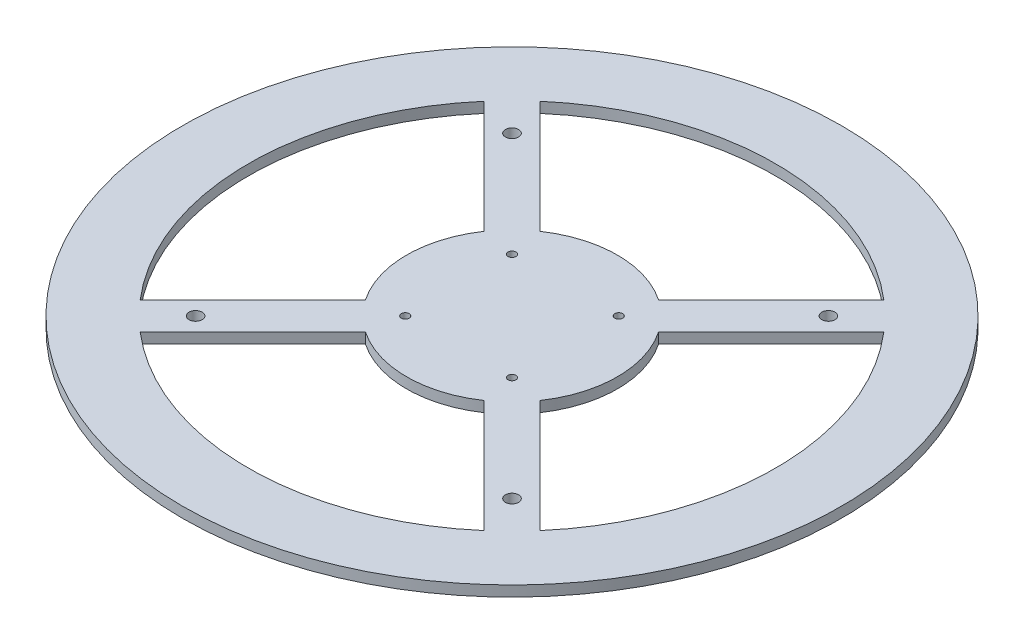
ISO-10303-21;
HEADER;
FILE_DESCRIPTION(('STEP AP214'),'2;1');
FILE_NAME('part.step','',(''),(''),'','','');
FILE_SCHEMA(('AUTOMOTIVE_DESIGN { 1 0 10303 214 1 1 1 1 }'));
ENDSEC;
DATA;
#1=APPLICATION_CONTEXT('core data for automotive mechanical design processes');
#2=APPLICATION_PROTOCOL_DEFINITION('international standard','automotive_design',2000,#1);
#3=PRODUCT_CONTEXT('',#1,'mechanical');
#4=PRODUCT('Part','Part','',(#3));
#5=PRODUCT_RELATED_PRODUCT_CATEGORY('part','',(#4));
#6=PRODUCT_DEFINITION_FORMATION('','',#4);
#7=PRODUCT_DEFINITION_CONTEXT('part definition',#1,'design');
#8=PRODUCT_DEFINITION('design','',#6,#7);
#9=PRODUCT_DEFINITION_SHAPE('','',#8);
#10=(LENGTH_UNIT() NAMED_UNIT(*) SI_UNIT(.MILLI.,.METRE.));
#11=(NAMED_UNIT(*) PLANE_ANGLE_UNIT() SI_UNIT($,.RADIAN.));
#12=(NAMED_UNIT(*) SI_UNIT($,.STERADIAN.) SOLID_ANGLE_UNIT());
#13=UNCERTAINTY_MEASURE_WITH_UNIT(LENGTH_MEASURE(1.E-05),#10,'distance_accuracy_value','');
#14=(GEOMETRIC_REPRESENTATION_CONTEXT(3) GLOBAL_UNCERTAINTY_ASSIGNED_CONTEXT((#13)) GLOBAL_UNIT_ASSIGNED_CONTEXT((#10,
#11,#12)) REPRESENTATION_CONTEXT('',''));
#15=CARTESIAN_POINT('',(0.,0.,0.));
#16=DIRECTION('',(0.,0.,1.));
#17=DIRECTION('',(1.,0.,0.));
#18=AXIS2_PLACEMENT_3D('',#15,#16,#17);
#19=CARTESIAN_POINT('',(0.,8.,0.));
#20=DIRECTION('',(0.,1.,0.));
#21=DIRECTION('',(0.,0.,1.));
#22=AXIS2_PLACEMENT_3D('',#19,#20,#21);
#23=PLANE('',#22);
#24=CARTESIAN_POINT('',(-40.499999999975,8.,40.5000000000209));
#25=DIRECTION('',(0.,1.,0.));
#26=DIRECTION('',(0.,0.,-1.));
#27=AXIS2_PLACEMENT_3D('',#24,#25,#26);
#28=CIRCLE('',#27,3.);
#29=CARTESIAN_POINT('',(-40.499999999975,8.,37.5000000000209));
#30=VERTEX_POINT('',#29);
#31=EDGE_CURVE('E469',#30,#30,#28,.T.);
#32=ORIENTED_EDGE('',*,*,#31,.F.);
#33=EDGE_LOOP('',(#32));
#34=FACE_BOUND('',#33,.T.);
#35=CARTESIAN_POINT('',(-40.5000000000205,8.,-40.4999999999755));
#36=DIRECTION('',(0.,1.,0.));
#37=DIRECTION('',(1.,0.,0.));
#38=AXIS2_PLACEMENT_3D('',#35,#36,#37);
#39=CIRCLE('',#38,3.);
#40=CARTESIAN_POINT('',(-37.5000000000205,8.,-40.4999999999754));
#41=VERTEX_POINT('',#40);
#42=EDGE_CURVE('E475',#41,#41,#39,.T.);
#43=ORIENTED_EDGE('',*,*,#42,.F.);
#44=EDGE_LOOP('',(#43));
#45=FACE_BOUND('',#44,.T.);
#46=CARTESIAN_POINT('',(40.5000000000208,8.,40.4999999999752));
#47=DIRECTION('',(0.,1.,0.));
#48=DIRECTION('',(-1.,0.,0.));
#49=AXIS2_PLACEMENT_3D('',#46,#47,#48);
#50=CIRCLE('',#49,3.);
#51=CARTESIAN_POINT('',(37.5000000000208,8.,40.4999999999752));
#52=VERTEX_POINT('',#51);
#53=EDGE_CURVE('E472',#52,#52,#50,.T.);
#54=ORIENTED_EDGE('',*,*,#53,.F.);
#55=EDGE_LOOP('',(#54));
#56=FACE_BOUND('',#55,.T.);
#57=CARTESIAN_POINT('',(40.499999999975,8.,-40.5000000000209));
#58=DIRECTION('',(0.,1.,0.));
#59=DIRECTION('',(0.,0.,1.));
#60=AXIS2_PLACEMENT_3D('',#57,#58,#59);
#61=CIRCLE('',#60,3.);
#62=CARTESIAN_POINT('',(40.499999999975,8.,-37.5000000000209));
#63=VERTEX_POINT('',#62);
#64=EDGE_CURVE('E483',#63,#63,#61,.T.);
#65=ORIENTED_EDGE('',*,*,#64,.F.);
#66=EDGE_LOOP('',(#65));
#67=FACE_BOUND('',#66,.T.);
#68=CARTESIAN_POINT('',(-120.000000000005,8.,-119.999999999997));
#69=DIRECTION('',(0.,1.,0.));
#70=DIRECTION('',(0.,0.,-1.));
#71=AXIS2_PLACEMENT_3D('',#68,#69,#70);
#72=CIRCLE('',#71,5.00000000001494);
#73=CARTESIAN_POINT('',(-120.000000000005,8.,-125.000000000012));
#74=VERTEX_POINT('',#73);
#75=EDGE_CURVE('E496',#74,#74,#72,.T.);
#76=ORIENTED_EDGE('',*,*,#75,.F.);
#77=EDGE_LOOP('',(#76));
#78=FACE_BOUND('',#77,.T.);
#79=CARTESIAN_POINT('',(119.999999999999,8.,-120.000000000004));
#80=DIRECTION('',(0.,1.,0.));
#81=DIRECTION('',(1.,0.,0.));
#82=AXIS2_PLACEMENT_3D('',#79,#80,#81);
#83=CIRCLE('',#82,5.00000000001494);
#84=CARTESIAN_POINT('',(125.000000000014,8.,-120.000000000004));
#85=VERTEX_POINT('',#84);
#86=EDGE_CURVE('E489',#85,#85,#83,.T.);
#87=ORIENTED_EDGE('',*,*,#86,.F.);
#88=EDGE_LOOP('',(#87));
#89=FACE_BOUND('',#88,.T.);
#90=CARTESIAN_POINT('',(-119.999999999998,8.,120.000000000005));
#91=DIRECTION('',(0.,1.,0.));
#92=DIRECTION('',(-1.,0.,0.));
#93=AXIS2_PLACEMENT_3D('',#90,#91,#92);
#94=CIRCLE('',#93,5.00000000001494);
#95=CARTESIAN_POINT('',(-125.000000000013,8.,120.000000000005));
#96=VERTEX_POINT('',#95);
#97=EDGE_CURVE('E495',#96,#96,#94,.T.);
#98=ORIENTED_EDGE('',*,*,#97,.F.);
#99=EDGE_LOOP('',(#98));
#100=FACE_BOUND('',#99,.T.);
#101=CARTESIAN_POINT('',(120.000000000005,8.,119.999999999997));
#102=DIRECTION('',(0.,1.,0.));
#103=DIRECTION('',(0.,0.,1.));
#104=AXIS2_PLACEMENT_3D('',#101,#102,#103);
#105=CIRCLE('',#104,5.00000000001494);
#106=CARTESIAN_POINT('',(120.000000000005,8.,125.000000000012));
#107=VERTEX_POINT('',#106);
#108=EDGE_CURVE('E507',#107,#107,#105,.T.);
#109=ORIENTED_EDGE('',*,*,#108,.F.);
#110=EDGE_LOOP('',(#109));
#111=FACE_BOUND('',#110,.T.);
#112=CARTESIAN_POINT('',(0.,8.,0.));
#113=DIRECTION('',(0.,1.,0.));
#114=DIRECTION('',(0.,0.,1.));
#115=AXIS2_PLACEMENT_3D('',#112,#113,#114);
#116=CIRCLE('',#115,250.);
#117=CARTESIAN_POINT('',(0.,8.,250.));
#118=VERTEX_POINT('',#117);
#119=EDGE_CURVE('E11',#118,#118,#116,.T.);
#120=ORIENTED_EDGE('',*,*,#119,.T.);
#121=EDGE_LOOP('',(#120));
#122=FACE_BOUND('',#121,.T.);
#123=DIRECTION('',(-0.707106781186551,0.,-0.707106781186544));
#124=VECTOR('',#123,1.);
#125=CARTESIAN_POINT('',(-66.1718786450306,8.,-44.9586752094336));
#126=LINE('',#125,#124);
#127=CARTESIAN_POINT('',(-66.1718786450306,8.,-44.9586752094336));
#128=VERTEX_POINT('',#127);
#129=CARTESIAN_POINT('',(-151.629649479503,8.,-130.416446043906));
#130=VERTEX_POINT('',#129);
#131=EDGE_CURVE('E250',#128,#130,#126,.T.);
#132=ORIENTED_EDGE('',*,*,#131,.F.);
#133=CARTESIAN_POINT('',(0.,8.,0.));
#134=DIRECTION('',(0.,-1.,0.));
#135=DIRECTION('',(0.,0.,1.));
#136=AXIS2_PLACEMENT_3D('',#133,#134,#135);
#137=CIRCLE('',#136,80.);
#138=CARTESIAN_POINT('',(-66.17187864503,8.,44.9586752094346));
#139=VERTEX_POINT('',#138);
#140=EDGE_CURVE('E248',#139,#128,#137,.T.);
#141=ORIENTED_EDGE('',*,*,#140,.F.);
#142=DIRECTION('',(0.707106781186541,0.,-0.707106781186554));
#143=VECTOR('',#142,1.);
#144=CARTESIAN_POINT('',(-66.17187864503,8.,44.9586752094346));
#145=LINE('',#144,#143);
#146=CARTESIAN_POINT('',(-151.629649479502,8.,130.416446043908));
#147=VERTEX_POINT('',#146);
#148=EDGE_CURVE('E256',#147,#139,#145,.T.);
#149=ORIENTED_EDGE('',*,*,#148,.F.);
#150=CARTESIAN_POINT('',(0.,8.,0.));
#151=DIRECTION('',(0.,1.,0.));
#152=DIRECTION('',(0.,0.,1.));
#153=AXIS2_PLACEMENT_3D('',#150,#151,#152);
#154=CIRCLE('',#153,200.);
#155=EDGE_CURVE('E253',#130,#147,#154,.T.);
#156=ORIENTED_EDGE('',*,*,#155,.F.);
#157=EDGE_LOOP('',(#132,#141,#149,#156));
#158=FACE_BOUND('',#157,.T.);
#159=DIRECTION('',(0.707106781186546,0.,-0.707106781186549));
#160=VECTOR('',#159,1.);
#161=CARTESIAN_POINT('',(44.9586752094338,8.,-66.1718786450305));
#162=LINE('',#161,#160);
#163=CARTESIAN_POINT('',(44.9586752094338,8.,-66.1718786450305));
#164=VERTEX_POINT('',#163);
#165=CARTESIAN_POINT('',(130.416446043906,8.,-151.629649479503));
#166=VERTEX_POINT('',#165);
#167=EDGE_CURVE('E219',#164,#166,#162,.T.);
#168=ORIENTED_EDGE('',*,*,#167,.F.);
#169=CARTESIAN_POINT('',(0.,8.,0.));
#170=DIRECTION('',(0.,-1.,0.));
#171=DIRECTION('',(0.,0.,1.));
#172=AXIS2_PLACEMENT_3D('',#169,#170,#171);
#173=CIRCLE('',#172,80.);
#174=CARTESIAN_POINT('',(-44.9586752094343,8.,-66.1718786450301));
#175=VERTEX_POINT('',#174);
#176=EDGE_CURVE('E217',#175,#164,#173,.T.);
#177=ORIENTED_EDGE('',*,*,#176,.F.);
#178=DIRECTION('',(0.707106781186551,0.,0.707106781186544));
#179=VECTOR('',#178,1.);
#180=CARTESIAN_POINT('',(-44.9586752094343,8.,-66.1718786450301));
#181=LINE('',#180,#179);
#182=CARTESIAN_POINT('',(-130.416446043907,8.,-151.629649479502));
#183=VERTEX_POINT('',#182);
#184=EDGE_CURVE('E225',#183,#175,#181,.T.);
#185=ORIENTED_EDGE('',*,*,#184,.F.);
#186=CARTESIAN_POINT('',(0.,8.,0.));
#187=DIRECTION('',(0.,1.,0.));
#188=DIRECTION('',(0.,0.,1.));
#189=AXIS2_PLACEMENT_3D('',#186,#187,#188);
#190=CIRCLE('',#189,200.);
#191=EDGE_CURVE('E222',#166,#183,#190,.T.);
#192=ORIENTED_EDGE('',*,*,#191,.F.);
#193=EDGE_LOOP('',(#168,#177,#185,#192));
#194=FACE_BOUND('',#193,.T.);
#195=DIRECTION('',(0.707106781186546,0.,0.707106781186549));
#196=VECTOR('',#195,1.);
#197=CARTESIAN_POINT('',(66.1718786450303,8.,44.958675209434));
#198=LINE('',#197,#196);
#199=CARTESIAN_POINT('',(66.1718786450303,8.,44.958675209434));
#200=VERTEX_POINT('',#199);
#201=CARTESIAN_POINT('',(151.629649479503,8.,130.416446043907));
#202=VERTEX_POINT('',#201);
#203=EDGE_CURVE('E188',#200,#202,#198,.T.);
#204=ORIENTED_EDGE('',*,*,#203,.F.);
#205=CARTESIAN_POINT('',(0.,8.,0.));
#206=DIRECTION('',(0.,-1.,0.));
#207=DIRECTION('',(0.,0.,1.));
#208=AXIS2_PLACEMENT_3D('',#205,#206,#207);
#209=CIRCLE('',#208,80.);
#210=CARTESIAN_POINT('',(66.1718786450303,8.,-44.9586752094341));
#211=VERTEX_POINT('',#210);
#212=EDGE_CURVE('E186',#211,#200,#209,.T.);
#213=ORIENTED_EDGE('',*,*,#212,.F.);
#214=DIRECTION('',(-0.707106781186546,0.,0.707106781186549));
#215=VECTOR('',#214,1.);
#216=CARTESIAN_POINT('',(66.1718786450303,8.,-44.9586752094341));
#217=LINE('',#216,#215);
#218=CARTESIAN_POINT('',(151.629649479503,8.,-130.416446043907));
#219=VERTEX_POINT('',#218);
#220=EDGE_CURVE('E194',#219,#211,#217,.T.);
#221=ORIENTED_EDGE('',*,*,#220,.F.);
#222=CARTESIAN_POINT('',(0.,8.,0.));
#223=DIRECTION('',(0.,1.,0.));
#224=DIRECTION('',(0.,0.,1.));
#225=AXIS2_PLACEMENT_3D('',#222,#223,#224);
#226=CIRCLE('',#225,200.);
#227=EDGE_CURVE('E191',#202,#219,#226,.T.);
#228=ORIENTED_EDGE('',*,*,#227,.F.);
#229=EDGE_LOOP('',(#204,#213,#221,#228));
#230=FACE_BOUND('',#229,.T.);
#231=DIRECTION('',(-0.707106781186551,0.,0.707106781186544));
#232=VECTOR('',#231,1.);
#233=CARTESIAN_POINT('',(-44.9586752094343,8.,66.1718786450302));
#234=LINE('',#233,#232);
#235=CARTESIAN_POINT('',(-44.9586752094343,8.,66.1718786450302));
#236=VERTEX_POINT('',#235);
#237=CARTESIAN_POINT('',(-130.416446043907,8.,151.629649479502));
#238=VERTEX_POINT('',#237);
#239=EDGE_CURVE('E156',#236,#238,#234,.T.);
#240=ORIENTED_EDGE('',*,*,#239,.F.);
#241=CARTESIAN_POINT('',(0.,8.,0.));
#242=DIRECTION('',(0.,-1.,0.));
#243=DIRECTION('',(0.,0.,1.));
#244=AXIS2_PLACEMENT_3D('',#241,#242,#243);
#245=CIRCLE('',#244,80.);
#246=CARTESIAN_POINT('',(44.9586752094339,8.,66.1718786450304));
#247=VERTEX_POINT('',#246);
#248=EDGE_CURVE('E148',#247,#236,#245,.T.);
#249=ORIENTED_EDGE('',*,*,#248,.F.);
#250=DIRECTION('',(-0.707106781186546,0.,-0.707106781186549));
#251=VECTOR('',#250,1.);
#252=CARTESIAN_POINT('',(44.9586752094339,8.,66.1718786450304));
#253=LINE('',#252,#251);
#254=CARTESIAN_POINT('',(130.416446043906,8.,151.629649479503));
#255=VERTEX_POINT('',#254);
#256=EDGE_CURVE('E170',#255,#247,#253,.T.);
#257=ORIENTED_EDGE('',*,*,#256,.F.);
#258=CARTESIAN_POINT('',(0.,8.,0.));
#259=DIRECTION('',(0.,1.,0.));
#260=DIRECTION('',(0.,0.,1.));
#261=AXIS2_PLACEMENT_3D('',#258,#259,#260);
#262=CIRCLE('',#261,200.);
#263=EDGE_CURVE('E168',#238,#255,#262,.T.);
#264=ORIENTED_EDGE('',*,*,#263,.F.);
#265=EDGE_LOOP('',(#240,#249,#257,#264));
#266=FACE_BOUND('',#265,.T.);
#267=ADVANCED_FACE('F35',(#34,#45,#56,#67,#78,#89,#100,#111,#122,#158,#194,#230,#266),#23,.T.);
#268=CARTESIAN_POINT('',(0.,0.,0.));
#269=DIRECTION('',(0.,1.,0.));
#270=DIRECTION('',(0.,0.,1.));
#271=AXIS2_PLACEMENT_3D('',#268,#269,#270);
#272=PLANE('',#271);
#273=CARTESIAN_POINT('',(-40.499999999975,0.,40.5000000000209));
#274=DIRECTION('',(0.,1.,0.));
#275=DIRECTION('',(0.,0.,-1.));
#276=AXIS2_PLACEMENT_3D('',#273,#274,#275);
#277=CIRCLE('',#276,3.);
#278=CARTESIAN_POINT('',(-40.499999999975,0.,37.5000000000209));
#279=VERTEX_POINT('',#278);
#280=EDGE_CURVE('E467',#279,#279,#277,.T.);
#281=ORIENTED_EDGE('',*,*,#280,.T.);
#282=EDGE_LOOP('',(#281));
#283=FACE_BOUND('',#282,.T.);
#284=CARTESIAN_POINT('',(-40.5000000000205,0.,-40.4999999999755));
#285=DIRECTION('',(0.,1.,0.));
#286=DIRECTION('',(1.,0.,0.));
#287=AXIS2_PLACEMENT_3D('',#284,#285,#286);
#288=CIRCLE('',#287,3.);
#289=CARTESIAN_POINT('',(-37.5000000000205,0.,-40.4999999999754));
#290=VERTEX_POINT('',#289);
#291=EDGE_CURVE('E470',#290,#290,#288,.T.);
#292=ORIENTED_EDGE('',*,*,#291,.T.);
#293=EDGE_LOOP('',(#292));
#294=FACE_BOUND('',#293,.T.);
#295=CARTESIAN_POINT('',(40.5000000000208,0.,40.4999999999752));
#296=DIRECTION('',(0.,1.,0.));
#297=DIRECTION('',(-1.,0.,0.));
#298=AXIS2_PLACEMENT_3D('',#295,#296,#297);
#299=CIRCLE('',#298,3.);
#300=CARTESIAN_POINT('',(37.5000000000208,0.,40.4999999999752));
#301=VERTEX_POINT('',#300);
#302=EDGE_CURVE('E480',#301,#301,#299,.T.);
#303=ORIENTED_EDGE('',*,*,#302,.T.);
#304=EDGE_LOOP('',(#303));
#305=FACE_BOUND('',#304,.T.);
#306=CARTESIAN_POINT('',(40.499999999975,0.,-40.5000000000209));
#307=DIRECTION('',(0.,1.,0.));
#308=DIRECTION('',(0.,0.,1.));
#309=AXIS2_PLACEMENT_3D('',#306,#307,#308);
#310=CIRCLE('',#309,3.);
#311=CARTESIAN_POINT('',(40.499999999975,0.,-37.5000000000209));
#312=VERTEX_POINT('',#311);
#313=EDGE_CURVE('E486',#312,#312,#310,.T.);
#314=ORIENTED_EDGE('',*,*,#313,.T.);
#315=EDGE_LOOP('',(#314));
#316=FACE_BOUND('',#315,.T.);
#317=CARTESIAN_POINT('',(-120.000000000005,0.,-119.999999999997));
#318=DIRECTION('',(0.,1.,0.));
#319=DIRECTION('',(0.,0.,-1.));
#320=AXIS2_PLACEMENT_3D('',#317,#318,#319);
#321=CIRCLE('',#320,5.00000000001494);
#322=CARTESIAN_POINT('',(-120.000000000005,0.,-125.000000000012));
#323=VERTEX_POINT('',#322);
#324=EDGE_CURVE('E492',#323,#323,#321,.T.);
#325=ORIENTED_EDGE('',*,*,#324,.T.);
#326=EDGE_LOOP('',(#325));
#327=FACE_BOUND('',#326,.T.);
#328=CARTESIAN_POINT('',(119.999999999999,0.,-120.000000000004));
#329=DIRECTION('',(0.,1.,0.));
#330=DIRECTION('',(1.,0.,0.));
#331=AXIS2_PLACEMENT_3D('',#328,#329,#330);
#332=CIRCLE('',#331,5.00000000001494);
#333=CARTESIAN_POINT('',(125.000000000014,0.,-120.000000000004));
#334=VERTEX_POINT('',#333);
#335=EDGE_CURVE('E499',#334,#334,#332,.T.);
#336=ORIENTED_EDGE('',*,*,#335,.T.);
#337=EDGE_LOOP('',(#336));
#338=FACE_BOUND('',#337,.T.);
#339=CARTESIAN_POINT('',(-119.999999999998,0.,120.000000000005));
#340=DIRECTION('',(0.,1.,0.));
#341=DIRECTION('',(-1.,0.,0.));
#342=AXIS2_PLACEMENT_3D('',#339,#340,#341);
#343=CIRCLE('',#342,5.00000000001494);
#344=CARTESIAN_POINT('',(-125.000000000013,0.,120.000000000005));
#345=VERTEX_POINT('',#344);
#346=EDGE_CURVE('E504',#345,#345,#343,.T.);
#347=ORIENTED_EDGE('',*,*,#346,.T.);
#348=EDGE_LOOP('',(#347));
#349=FACE_BOUND('',#348,.T.);
#350=CARTESIAN_POINT('',(120.000000000005,0.,119.999999999997));
#351=DIRECTION('',(0.,1.,0.));
#352=DIRECTION('',(0.,0.,1.));
#353=AXIS2_PLACEMENT_3D('',#350,#351,#352);
#354=CIRCLE('',#353,5.00000000001494);
#355=CARTESIAN_POINT('',(120.000000000005,0.,125.000000000012));
#356=VERTEX_POINT('',#355);
#357=EDGE_CURVE('E176',#356,#356,#354,.T.);
#358=ORIENTED_EDGE('',*,*,#357,.T.);
#359=EDGE_LOOP('',(#358));
#360=FACE_BOUND('',#359,.T.);
#361=CARTESIAN_POINT('',(0.,0.,0.));
#362=DIRECTION('',(0.,-1.,0.));
#363=DIRECTION('',(0.,0.,1.));
#364=AXIS2_PLACEMENT_3D('',#361,#362,#363);
#365=CIRCLE('',#364,80.);
#366=CARTESIAN_POINT('',(66.1718786450303,0.,-44.9586752094341));
#367=VERTEX_POINT('',#366);
#368=CARTESIAN_POINT('',(66.1718786450303,0.,44.958675209434));
#369=VERTEX_POINT('',#368);
#370=EDGE_CURVE('E164',#367,#369,#365,.T.);
#371=ORIENTED_EDGE('',*,*,#370,.T.);
#372=DIRECTION('',(0.707106781186546,0.,0.707106781186549));
#373=VECTOR('',#372,1.);
#374=CARTESIAN_POINT('',(66.1718786450303,0.,44.958675209434));
#375=LINE('',#374,#373);
#376=CARTESIAN_POINT('',(151.629649479503,0.,130.416446043907));
#377=VERTEX_POINT('',#376);
#378=EDGE_CURVE('E199',#369,#377,#375,.T.);
#379=ORIENTED_EDGE('',*,*,#378,.T.);
#380=CARTESIAN_POINT('',(0.,0.,0.));
#381=DIRECTION('',(0.,1.,0.));
#382=DIRECTION('',(0.,0.,1.));
#383=AXIS2_PLACEMENT_3D('',#380,#381,#382);
#384=CIRCLE('',#383,200.);
#385=CARTESIAN_POINT('',(151.629649479503,0.,-130.416446043907));
#386=VERTEX_POINT('',#385);
#387=EDGE_CURVE('E202',#377,#386,#384,.T.);
#388=ORIENTED_EDGE('',*,*,#387,.T.);
#389=DIRECTION('',(-0.707106781186546,0.,0.707106781186549));
#390=VECTOR('',#389,1.);
#391=CARTESIAN_POINT('',(66.1718786450303,0.,-44.9586752094341));
#392=LINE('',#391,#390);
#393=EDGE_CURVE('E189',#386,#367,#392,.T.);
#394=ORIENTED_EDGE('',*,*,#393,.T.);
#395=EDGE_LOOP('',(#371,#379,#388,#394));
#396=FACE_BOUND('',#395,.T.);
#397=CARTESIAN_POINT('',(0.,0.,0.));
#398=DIRECTION('',(0.,-1.,0.));
#399=DIRECTION('',(0.,0.,1.));
#400=AXIS2_PLACEMENT_3D('',#397,#398,#399);
#401=CIRCLE('',#400,80.);
#402=CARTESIAN_POINT('',(-66.17187864503,0.,44.9586752094346));
#403=VERTEX_POINT('',#402);
#404=CARTESIAN_POINT('',(-66.1718786450306,0.,-44.9586752094336));
#405=VERTEX_POINT('',#404);
#406=EDGE_CURVE('E247',#403,#405,#401,.T.);
#407=ORIENTED_EDGE('',*,*,#406,.T.);
#408=DIRECTION('',(-0.707106781186551,0.,-0.707106781186544));
#409=VECTOR('',#408,1.);
#410=CARTESIAN_POINT('',(-66.1718786450306,0.,-44.9586752094336));
#411=LINE('',#410,#409);
#412=CARTESIAN_POINT('',(-151.629649479503,0.,-130.416446043906));
#413=VERTEX_POINT('',#412);
#414=EDGE_CURVE('E261',#405,#413,#411,.T.);
#415=ORIENTED_EDGE('',*,*,#414,.T.);
#416=CARTESIAN_POINT('',(0.,0.,0.));
#417=DIRECTION('',(0.,1.,0.));
#418=DIRECTION('',(0.,0.,1.));
#419=AXIS2_PLACEMENT_3D('',#416,#417,#418);
#420=CIRCLE('',#419,200.);
#421=CARTESIAN_POINT('',(-151.629649479502,0.,130.416446043908));
#422=VERTEX_POINT('',#421);
#423=EDGE_CURVE('E264',#413,#422,#420,.T.);
#424=ORIENTED_EDGE('',*,*,#423,.T.);
#425=DIRECTION('',(0.707106781186541,0.,-0.707106781186554));
#426=VECTOR('',#425,1.);
#427=CARTESIAN_POINT('',(-66.17187864503,0.,44.9586752094346));
#428=LINE('',#427,#426);
#429=EDGE_CURVE('E251',#422,#403,#428,.T.);
#430=ORIENTED_EDGE('',*,*,#429,.T.);
#431=EDGE_LOOP('',(#407,#415,#424,#430));
#432=FACE_BOUND('',#431,.T.);
#433=CARTESIAN_POINT('',(0.,0.,0.));
#434=DIRECTION('',(0.,1.,0.));
#435=DIRECTION('',(0.,0.,1.));
#436=AXIS2_PLACEMENT_3D('',#433,#434,#435);
#437=CIRCLE('',#436,250.);
#438=CARTESIAN_POINT('',(0.,0.,250.));
#439=VERTEX_POINT('',#438);
#440=EDGE_CURVE('E39',#439,#439,#437,.T.);
#441=ORIENTED_EDGE('',*,*,#440,.F.);
#442=EDGE_LOOP('',(#441));
#443=FACE_BOUND('',#442,.T.);
#444=CARTESIAN_POINT('',(0.,0.,0.));
#445=DIRECTION('',(0.,-1.,0.));
#446=DIRECTION('',(0.,0.,1.));
#447=AXIS2_PLACEMENT_3D('',#444,#445,#446);
#448=CIRCLE('',#447,80.);
#449=CARTESIAN_POINT('',(-44.9586752094343,0.,-66.1718786450301));
#450=VERTEX_POINT('',#449);
#451=CARTESIAN_POINT('',(44.9586752094338,0.,-66.1718786450305));
#452=VERTEX_POINT('',#451);
#453=EDGE_CURVE('E216',#450,#452,#448,.T.);
#454=ORIENTED_EDGE('',*,*,#453,.T.);
#455=DIRECTION('',(0.707106781186546,0.,-0.707106781186549));
#456=VECTOR('',#455,1.);
#457=CARTESIAN_POINT('',(44.9586752094338,0.,-66.1718786450305));
#458=LINE('',#457,#456);
#459=CARTESIAN_POINT('',(130.416446043906,0.,-151.629649479503));
#460=VERTEX_POINT('',#459);
#461=EDGE_CURVE('E230',#452,#460,#458,.T.);
#462=ORIENTED_EDGE('',*,*,#461,.T.);
#463=CARTESIAN_POINT('',(0.,0.,0.));
#464=DIRECTION('',(0.,1.,0.));
#465=DIRECTION('',(0.,0.,1.));
#466=AXIS2_PLACEMENT_3D('',#463,#464,#465);
#467=CIRCLE('',#466,200.);
#468=CARTESIAN_POINT('',(-130.416446043907,0.,-151.629649479502));
#469=VERTEX_POINT('',#468);
#470=EDGE_CURVE('E233',#460,#469,#467,.T.);
#471=ORIENTED_EDGE('',*,*,#470,.T.);
#472=DIRECTION('',(0.707106781186551,0.,0.707106781186544));
#473=VECTOR('',#472,1.);
#474=CARTESIAN_POINT('',(-44.9586752094343,0.,-66.1718786450301));
#475=LINE('',#474,#473);
#476=EDGE_CURVE('E220',#469,#450,#475,.T.);
#477=ORIENTED_EDGE('',*,*,#476,.T.);
#478=EDGE_LOOP('',(#454,#462,#471,#477));
#479=FACE_BOUND('',#478,.T.);
#480=CARTESIAN_POINT('',(0.,0.,0.));
#481=DIRECTION('',(0.,-1.,0.));
#482=DIRECTION('',(0.,0.,1.));
#483=AXIS2_PLACEMENT_3D('',#480,#481,#482);
#484=CIRCLE('',#483,80.);
#485=CARTESIAN_POINT('',(44.9586752094339,0.,66.1718786450304));
#486=VERTEX_POINT('',#485);
#487=CARTESIAN_POINT('',(-44.9586752094343,0.,66.1718786450302));
#488=VERTEX_POINT('',#487);
#489=EDGE_CURVE('E58',#486,#488,#484,.T.);
#490=ORIENTED_EDGE('',*,*,#489,.T.);
#491=DIRECTION('',(-0.707106781186551,0.,0.707106781186544));
#492=VECTOR('',#491,1.);
#493=CARTESIAN_POINT('',(-44.9586752094343,0.,66.1718786450302));
#494=LINE('',#493,#492);
#495=CARTESIAN_POINT('',(-130.416446043907,0.,151.629649479502));
#496=VERTEX_POINT('',#495);
#497=EDGE_CURVE('E163',#488,#496,#494,.T.);
#498=ORIENTED_EDGE('',*,*,#497,.T.);
#499=CARTESIAN_POINT('',(0.,0.,0.));
#500=DIRECTION('',(0.,1.,0.));
#501=DIRECTION('',(0.,0.,1.));
#502=AXIS2_PLACEMENT_3D('',#499,#500,#501);
#503=CIRCLE('',#502,200.);
#504=CARTESIAN_POINT('',(130.416446043906,0.,151.629649479503));
#505=VERTEX_POINT('',#504);
#506=EDGE_CURVE('E178',#496,#505,#503,.T.);
#507=ORIENTED_EDGE('',*,*,#506,.T.);
#508=DIRECTION('',(-0.707106781186546,0.,-0.707106781186549));
#509=VECTOR('',#508,1.);
#510=CARTESIAN_POINT('',(44.9586752094339,0.,66.1718786450304));
#511=LINE('',#510,#509);
#512=EDGE_CURVE('E157',#505,#486,#511,.T.);
#513=ORIENTED_EDGE('',*,*,#512,.T.);
#514=EDGE_LOOP('',(#490,#498,#507,#513));
#515=FACE_BOUND('',#514,.T.);
#516=ADVANCED_FACE('F283',(#283,#294,#305,#316,#327,#338,#349,#360,#396,#432,#443,#479,#515),
#272,.F.);
#517=CARTESIAN_POINT('',(0.,8.,0.));
#518=DIRECTION('',(0.,-1.,0.));
#519=DIRECTION('',(0.,0.,-1.));
#520=AXIS2_PLACEMENT_3D('',#517,#518,#519);
#521=CYLINDRICAL_SURFACE('',#520,250.);
#522=ORIENTED_EDGE('',*,*,#119,.F.);
#523=EDGE_LOOP('',(#522));
#524=FACE_BOUND('',#523,.T.);
#525=ORIENTED_EDGE('',*,*,#440,.T.);
#526=EDGE_LOOP('',(#525));
#527=FACE_BOUND('',#526,.T.);
#528=ADVANCED_FACE('F37',(#524,#527),#521,.T.);
#529=CARTESIAN_POINT('',(0.,8.,0.));
#530=DIRECTION('',(0.,-1.,0.));
#531=DIRECTION('',(0.,0.,-1.));
#532=AXIS2_PLACEMENT_3D('',#529,#530,#531);
#533=CYLINDRICAL_SURFACE('',#532,80.);
#534=ORIENTED_EDGE('',*,*,#406,.F.);
#535=DIRECTION('',(0.,-1.,0.));
#536=VECTOR('',#535,1.);
#537=CARTESIAN_POINT('',(-66.17187864503,8.,44.9586752094346));
#538=LINE('',#537,#536);
#539=EDGE_CURVE('E258',#139,#403,#538,.T.);
#540=ORIENTED_EDGE('',*,*,#539,.F.);
#541=ORIENTED_EDGE('',*,*,#140,.T.);
#542=DIRECTION('',(0.,-1.,0.));
#543=VECTOR('',#542,1.);
#544=CARTESIAN_POINT('',(-66.1718786450306,8.,-44.9586752094336));
#545=LINE('',#544,#543);
#546=EDGE_CURVE('E275',#128,#405,#545,.T.);
#547=ORIENTED_EDGE('',*,*,#546,.T.);
#548=EDGE_LOOP('',(#534,#540,#541,#547));
#549=FACE_BOUND('',#548,.T.);
#550=ADVANCED_FACE('F311',(#549),#533,.T.);
#551=CARTESIAN_POINT('',(-66.1718786450306,8.,-44.9586752094336));
#552=DIRECTION('',(-0.707106781186544,0.,0.707106781186551));
#553=DIRECTION('',(0.707106781186551,0.,0.707106781186544));
#554=AXIS2_PLACEMENT_3D('',#551,#552,#553);
#555=PLANE('',#554);
#556=ORIENTED_EDGE('',*,*,#414,.F.);
#557=ORIENTED_EDGE('',*,*,#546,.F.);
#558=ORIENTED_EDGE('',*,*,#131,.T.);
#559=DIRECTION('',(0.,-1.,0.));
#560=VECTOR('',#559,1.);
#561=CARTESIAN_POINT('',(-151.629649479503,8.,-130.416446043906));
#562=LINE('',#561,#560);
#563=EDGE_CURVE('E273',#130,#413,#562,.T.);
#564=ORIENTED_EDGE('',*,*,#563,.T.);
#565=EDGE_LOOP('',(#556,#557,#558,#564));
#566=FACE_BOUND('',#565,.T.);
#567=ADVANCED_FACE('F314',(#566),#555,.T.);
#568=CARTESIAN_POINT('',(0.,8.,0.));
#569=DIRECTION('',(0.,-1.,0.));
#570=DIRECTION('',(0.,0.,-1.));
#571=AXIS2_PLACEMENT_3D('',#568,#569,#570);
#572=CYLINDRICAL_SURFACE('',#571,200.);
#573=ORIENTED_EDGE('',*,*,#423,.F.);
#574=ORIENTED_EDGE('',*,*,#563,.F.);
#575=ORIENTED_EDGE('',*,*,#155,.T.);
#576=DIRECTION('',(0.,-1.,0.));
#577=VECTOR('',#576,1.);
#578=CARTESIAN_POINT('',(-151.629649479502,8.,130.416446043908));
#579=LINE('',#578,#577);
#580=EDGE_CURVE('E271',#147,#422,#579,.T.);
#581=ORIENTED_EDGE('',*,*,#580,.T.);
#582=EDGE_LOOP('',(#573,#574,#575,#581));
#583=FACE_BOUND('',#582,.T.);
#584=ADVANCED_FACE('F317',(#583),#572,.F.);
#585=CARTESIAN_POINT('',(-66.17187864503,8.,44.9586752094346));
#586=DIRECTION('',(-0.707106781186554,0.,-0.707106781186541));
#587=DIRECTION('',(-0.707106781186541,0.,0.707106781186554));
#588=AXIS2_PLACEMENT_3D('',#585,#586,#587);
#589=PLANE('',#588);
#590=ORIENTED_EDGE('',*,*,#429,.F.);
#591=ORIENTED_EDGE('',*,*,#580,.F.);
#592=ORIENTED_EDGE('',*,*,#148,.T.);
#593=ORIENTED_EDGE('',*,*,#539,.T.);
#594=EDGE_LOOP('',(#590,#591,#592,#593));
#595=FACE_BOUND('',#594,.T.);
#596=ADVANCED_FACE('F321',(#595),#589,.T.);
#597=CARTESIAN_POINT('',(0.,8.,0.));
#598=DIRECTION('',(0.,-1.,0.));
#599=DIRECTION('',(0.,0.,-1.));
#600=AXIS2_PLACEMENT_3D('',#597,#598,#599);
#601=CYLINDRICAL_SURFACE('',#600,80.);
#602=ORIENTED_EDGE('',*,*,#453,.F.);
#603=DIRECTION('',(0.,-1.,0.));
#604=VECTOR('',#603,1.);
#605=CARTESIAN_POINT('',(-44.9586752094343,8.,-66.1718786450301));
#606=LINE('',#605,#604);
#607=EDGE_CURVE('E227',#175,#450,#606,.T.);
#608=ORIENTED_EDGE('',*,*,#607,.F.);
#609=ORIENTED_EDGE('',*,*,#176,.T.);
#610=DIRECTION('',(0.,-1.,0.));
#611=VECTOR('',#610,1.);
#612=CARTESIAN_POINT('',(44.9586752094338,8.,-66.1718786450305));
#613=LINE('',#612,#611);
#614=EDGE_CURVE('E244',#164,#452,#613,.T.);
#615=ORIENTED_EDGE('',*,*,#614,.T.);
#616=EDGE_LOOP('',(#602,#608,#609,#615));
#617=FACE_BOUND('',#616,.T.);
#618=ADVANCED_FACE('F325',(#617),#601,.T.);
#619=CARTESIAN_POINT('',(44.9586752094338,8.,-66.1718786450305));
#620=DIRECTION('',(-0.707106781186549,0.,-0.707106781186546));
#621=DIRECTION('',(-0.707106781186546,0.,0.707106781186549));
#622=AXIS2_PLACEMENT_3D('',#619,#620,#621);
#623=PLANE('',#622);
#624=ORIENTED_EDGE('',*,*,#461,.F.);
#625=ORIENTED_EDGE('',*,*,#614,.F.);
#626=ORIENTED_EDGE('',*,*,#167,.T.);
#627=DIRECTION('',(0.,-1.,0.));
#628=VECTOR('',#627,1.);
#629=CARTESIAN_POINT('',(130.416446043906,8.,-151.629649479503));
#630=LINE('',#629,#628);
#631=EDGE_CURVE('E242',#166,#460,#630,.T.);
#632=ORIENTED_EDGE('',*,*,#631,.T.);
#633=EDGE_LOOP('',(#624,#625,#626,#632));
#634=FACE_BOUND('',#633,.T.);
#635=ADVANCED_FACE('F329',(#634),#623,.T.);
#636=CARTESIAN_POINT('',(0.,8.,0.));
#637=DIRECTION('',(0.,-1.,0.));
#638=DIRECTION('',(0.,0.,-1.));
#639=AXIS2_PLACEMENT_3D('',#636,#637,#638);
#640=CYLINDRICAL_SURFACE('',#639,200.);
#641=ORIENTED_EDGE('',*,*,#470,.F.);
#642=ORIENTED_EDGE('',*,*,#631,.F.);
#643=ORIENTED_EDGE('',*,*,#191,.T.);
#644=DIRECTION('',(0.,-1.,0.));
#645=VECTOR('',#644,1.);
#646=CARTESIAN_POINT('',(-130.416446043907,8.,-151.629649479502));
#647=LINE('',#646,#645);
#648=EDGE_CURVE('E240',#183,#469,#647,.T.);
#649=ORIENTED_EDGE('',*,*,#648,.T.);
#650=EDGE_LOOP('',(#641,#642,#643,#649));
#651=FACE_BOUND('',#650,.T.);
#652=ADVANCED_FACE('F333',(#651),#640,.F.);
#653=CARTESIAN_POINT('',(-44.9586752094343,8.,-66.1718786450301));
#654=DIRECTION('',(0.707106781186544,0.,-0.707106781186551));
#655=DIRECTION('',(-0.707106781186551,0.,-0.707106781186544));
#656=AXIS2_PLACEMENT_3D('',#653,#654,#655);
#657=PLANE('',#656);
#658=ORIENTED_EDGE('',*,*,#476,.F.);
#659=ORIENTED_EDGE('',*,*,#648,.F.);
#660=ORIENTED_EDGE('',*,*,#184,.T.);
#661=ORIENTED_EDGE('',*,*,#607,.T.);
#662=EDGE_LOOP('',(#658,#659,#660,#661));
#663=FACE_BOUND('',#662,.T.);
#664=ADVANCED_FACE('F337',(#663),#657,.T.);
#665=CARTESIAN_POINT('',(0.,8.,0.));
#666=DIRECTION('',(0.,-1.,0.));
#667=DIRECTION('',(0.,0.,-1.));
#668=AXIS2_PLACEMENT_3D('',#665,#666,#667);
#669=CYLINDRICAL_SURFACE('',#668,80.);
#670=ORIENTED_EDGE('',*,*,#370,.F.);
#671=DIRECTION('',(0.,-1.,0.));
#672=VECTOR('',#671,1.);
#673=CARTESIAN_POINT('',(66.1718786450303,8.,-44.9586752094341));
#674=LINE('',#673,#672);
#675=EDGE_CURVE('E196',#211,#367,#674,.T.);
#676=ORIENTED_EDGE('',*,*,#675,.F.);
#677=ORIENTED_EDGE('',*,*,#212,.T.);
#678=DIRECTION('',(0.,-1.,0.));
#679=VECTOR('',#678,1.);
#680=CARTESIAN_POINT('',(66.1718786450303,8.,44.958675209434));
#681=LINE('',#680,#679);
#682=EDGE_CURVE('E213',#200,#369,#681,.T.);
#683=ORIENTED_EDGE('',*,*,#682,.T.);
#684=EDGE_LOOP('',(#670,#676,#677,#683));
#685=FACE_BOUND('',#684,.T.);
#686=ADVANCED_FACE('F341',(#685),#669,.T.);
#687=CARTESIAN_POINT('',(66.1718786450303,8.,44.958675209434));
#688=DIRECTION('',(0.707106781186549,0.,-0.707106781186546));
#689=DIRECTION('',(-0.707106781186546,0.,-0.707106781186549));
#690=AXIS2_PLACEMENT_3D('',#687,#688,#689);
#691=PLANE('',#690);
#692=ORIENTED_EDGE('',*,*,#378,.F.);
#693=ORIENTED_EDGE('',*,*,#682,.F.);
#694=ORIENTED_EDGE('',*,*,#203,.T.);
#695=DIRECTION('',(0.,-1.,0.));
#696=VECTOR('',#695,1.);
#697=CARTESIAN_POINT('',(151.629649479503,8.,130.416446043907));
#698=LINE('',#697,#696);
#699=EDGE_CURVE('E211',#202,#377,#698,.T.);
#700=ORIENTED_EDGE('',*,*,#699,.T.);
#701=EDGE_LOOP('',(#692,#693,#694,#700));
#702=FACE_BOUND('',#701,.T.);
#703=ADVANCED_FACE('F345',(#702),#691,.T.);
#704=CARTESIAN_POINT('',(0.,8.,0.));
#705=DIRECTION('',(0.,-1.,0.));
#706=DIRECTION('',(0.,0.,-1.));
#707=AXIS2_PLACEMENT_3D('',#704,#705,#706);
#708=CYLINDRICAL_SURFACE('',#707,200.);
#709=ORIENTED_EDGE('',*,*,#387,.F.);
#710=ORIENTED_EDGE('',*,*,#699,.F.);
#711=ORIENTED_EDGE('',*,*,#227,.T.);
#712=DIRECTION('',(0.,-1.,0.));
#713=VECTOR('',#712,1.);
#714=CARTESIAN_POINT('',(151.629649479503,8.,-130.416446043907));
#715=LINE('',#714,#713);
#716=EDGE_CURVE('E209',#219,#386,#715,.T.);
#717=ORIENTED_EDGE('',*,*,#716,.T.);
#718=EDGE_LOOP('',(#709,#710,#711,#717));
#719=FACE_BOUND('',#718,.T.);
#720=ADVANCED_FACE('F349',(#719),#708,.F.);
#721=CARTESIAN_POINT('',(66.1718786450303,8.,-44.9586752094341));
#722=DIRECTION('',(0.707106781186549,0.,0.707106781186546));
#723=DIRECTION('',(0.707106781186546,0.,-0.707106781186549));
#724=AXIS2_PLACEMENT_3D('',#721,#722,#723);
#725=PLANE('',#724);
#726=ORIENTED_EDGE('',*,*,#393,.F.);
#727=ORIENTED_EDGE('',*,*,#716,.F.);
#728=ORIENTED_EDGE('',*,*,#220,.T.);
#729=ORIENTED_EDGE('',*,*,#675,.T.);
#730=EDGE_LOOP('',(#726,#727,#728,#729));
#731=FACE_BOUND('',#730,.T.);
#732=ADVANCED_FACE('F353',(#731),#725,.T.);
#733=CARTESIAN_POINT('',(0.,8.,0.));
#734=DIRECTION('',(0.,-1.,0.));
#735=DIRECTION('',(0.,0.,-1.));
#736=AXIS2_PLACEMENT_3D('',#733,#734,#735);
#737=CYLINDRICAL_SURFACE('',#736,80.);
#738=ORIENTED_EDGE('',*,*,#489,.F.);
#739=DIRECTION('',(0.,-1.,0.));
#740=VECTOR('',#739,1.);
#741=CARTESIAN_POINT('',(44.9586752094339,8.,66.1718786450304));
#742=LINE('',#741,#740);
#743=EDGE_CURVE('E152',#247,#486,#742,.T.);
#744=ORIENTED_EDGE('',*,*,#743,.F.);
#745=ORIENTED_EDGE('',*,*,#248,.T.);
#746=DIRECTION('',(0.,-1.,0.));
#747=VECTOR('',#746,1.);
#748=CARTESIAN_POINT('',(-44.9586752094343,8.,66.1718786450302));
#749=LINE('',#748,#747);
#750=EDGE_CURVE('E151',#236,#488,#749,.T.);
#751=ORIENTED_EDGE('',*,*,#750,.T.);
#752=EDGE_LOOP('',(#738,#744,#745,#751));
#753=FACE_BOUND('',#752,.T.);
#754=ADVANCED_FACE('F150',(#753),#737,.T.);
#755=CARTESIAN_POINT('',(-44.9586752094343,8.,66.1718786450302));
#756=DIRECTION('',(0.707106781186544,0.,0.707106781186551));
#757=DIRECTION('',(0.707106781186551,0.,-0.707106781186544));
#758=AXIS2_PLACEMENT_3D('',#755,#756,#757);
#759=PLANE('',#758);
#760=ORIENTED_EDGE('',*,*,#497,.F.);
#761=ORIENTED_EDGE('',*,*,#750,.F.);
#762=ORIENTED_EDGE('',*,*,#239,.T.);
#763=DIRECTION('',(0.,-1.,0.));
#764=VECTOR('',#763,1.);
#765=CARTESIAN_POINT('',(-130.416446043907,8.,151.629649479502));
#766=LINE('',#765,#764);
#767=EDGE_CURVE('E165',#238,#496,#766,.T.);
#768=ORIENTED_EDGE('',*,*,#767,.T.);
#769=EDGE_LOOP('',(#760,#761,#762,#768));
#770=FACE_BOUND('',#769,.T.);
#771=ADVANCED_FACE('F160',(#770),#759,.T.);
#772=CARTESIAN_POINT('',(0.,8.,0.));
#773=DIRECTION('',(0.,-1.,0.));
#774=DIRECTION('',(0.,0.,-1.));
#775=AXIS2_PLACEMENT_3D('',#772,#773,#774);
#776=CYLINDRICAL_SURFACE('',#775,200.);
#777=ORIENTED_EDGE('',*,*,#506,.F.);
#778=ORIENTED_EDGE('',*,*,#767,.F.);
#779=ORIENTED_EDGE('',*,*,#263,.T.);
#780=DIRECTION('',(0.,-1.,0.));
#781=VECTOR('',#780,1.);
#782=CARTESIAN_POINT('',(130.416446043906,8.,151.629649479503));
#783=LINE('',#782,#781);
#784=EDGE_CURVE('E50',#255,#505,#783,.T.);
#785=ORIENTED_EDGE('',*,*,#784,.T.);
#786=EDGE_LOOP('',(#777,#778,#779,#785));
#787=FACE_BOUND('',#786,.T.);
#788=ADVANCED_FACE('F292',(#787),#776,.F.);
#789=CARTESIAN_POINT('',(44.9586752094339,8.,66.1718786450304));
#790=DIRECTION('',(-0.707106781186549,0.,0.707106781186546));
#791=DIRECTION('',(0.707106781186546,0.,0.707106781186549));
#792=AXIS2_PLACEMENT_3D('',#789,#790,#791);
#793=PLANE('',#792);
#794=ORIENTED_EDGE('',*,*,#512,.F.);
#795=ORIENTED_EDGE('',*,*,#784,.F.);
#796=ORIENTED_EDGE('',*,*,#256,.T.);
#797=ORIENTED_EDGE('',*,*,#743,.T.);
#798=EDGE_LOOP('',(#794,#795,#796,#797));
#799=FACE_BOUND('',#798,.T.);
#800=ADVANCED_FACE('F289',(#799),#793,.T.);
#801=CARTESIAN_POINT('',(120.000000000005,0.,119.999999999997));
#802=DIRECTION('',(0.,1.,0.));
#803=DIRECTION('',(0.,0.,1.));
#804=AXIS2_PLACEMENT_3D('',#801,#802,#803);
#805=CYLINDRICAL_SURFACE('',#804,5.00000000001494);
#806=ORIENTED_EDGE('',*,*,#357,.F.);
#807=EDGE_LOOP('',(#806));
#808=FACE_BOUND('',#807,.T.);
#809=ORIENTED_EDGE('',*,*,#108,.T.);
#810=EDGE_LOOP('',(#809));
#811=FACE_BOUND('',#810,.T.);
#812=ADVANCED_FACE('F291',(#808,#811),#805,.F.);
#813=CARTESIAN_POINT('',(-119.999999999998,0.,120.000000000005));
#814=DIRECTION('',(0.,1.,0.));
#815=DIRECTION('',(0.,0.,1.));
#816=AXIS2_PLACEMENT_3D('',#813,#814,#815);
#817=CYLINDRICAL_SURFACE('',#816,5.00000000001494);
#818=ORIENTED_EDGE('',*,*,#346,.F.);
#819=EDGE_LOOP('',(#818));
#820=FACE_BOUND('',#819,.T.);
#821=ORIENTED_EDGE('',*,*,#97,.T.);
#822=EDGE_LOOP('',(#821));
#823=FACE_BOUND('',#822,.T.);
#824=ADVANCED_FACE('F298',(#820,#823),#817,.F.);
#825=CARTESIAN_POINT('',(119.999999999999,0.,-120.000000000004));
#826=DIRECTION('',(0.,1.,0.));
#827=DIRECTION('',(0.,0.,1.));
#828=AXIS2_PLACEMENT_3D('',#825,#826,#827);
#829=CYLINDRICAL_SURFACE('',#828,5.00000000001494);
#830=ORIENTED_EDGE('',*,*,#335,.F.);
#831=EDGE_LOOP('',(#830));
#832=FACE_BOUND('',#831,.T.);
#833=ORIENTED_EDGE('',*,*,#86,.T.);
#834=EDGE_LOOP('',(#833));
#835=FACE_BOUND('',#834,.T.);
#836=ADVANCED_FACE('F388',(#832,#835),#829,.F.);
#837=CARTESIAN_POINT('',(-120.000000000005,0.,-119.999999999997));
#838=DIRECTION('',(0.,1.,0.));
#839=DIRECTION('',(0.,0.,1.));
#840=AXIS2_PLACEMENT_3D('',#837,#838,#839);
#841=CYLINDRICAL_SURFACE('',#840,5.00000000001494);
#842=ORIENTED_EDGE('',*,*,#324,.F.);
#843=EDGE_LOOP('',(#842));
#844=FACE_BOUND('',#843,.T.);
#845=ORIENTED_EDGE('',*,*,#75,.T.);
#846=EDGE_LOOP('',(#845));
#847=FACE_BOUND('',#846,.T.);
#848=ADVANCED_FACE('F398',(#844,#847),#841,.F.);
#849=CARTESIAN_POINT('',(40.499999999975,0.,-40.5000000000209));
#850=DIRECTION('',(0.,1.,0.));
#851=DIRECTION('',(0.,0.,1.));
#852=AXIS2_PLACEMENT_3D('',#849,#850,#851);
#853=CYLINDRICAL_SURFACE('',#852,3.);
#854=ORIENTED_EDGE('',*,*,#313,.F.);
#855=EDGE_LOOP('',(#854));
#856=FACE_BOUND('',#855,.T.);
#857=ORIENTED_EDGE('',*,*,#64,.T.);
#858=EDGE_LOOP('',(#857));
#859=FACE_BOUND('',#858,.T.);
#860=ADVANCED_FACE('F408',(#856,#859),#853,.F.);
#861=CARTESIAN_POINT('',(40.5000000000208,0.,40.4999999999752));
#862=DIRECTION('',(0.,1.,0.));
#863=DIRECTION('',(0.,0.,1.));
#864=AXIS2_PLACEMENT_3D('',#861,#862,#863);
#865=CYLINDRICAL_SURFACE('',#864,3.);
#866=ORIENTED_EDGE('',*,*,#302,.F.);
#867=EDGE_LOOP('',(#866));
#868=FACE_BOUND('',#867,.T.);
#869=ORIENTED_EDGE('',*,*,#53,.T.);
#870=EDGE_LOOP('',(#869));
#871=FACE_BOUND('',#870,.T.);
#872=ADVANCED_FACE('F417',(#868,#871),#865,.F.);
#873=CARTESIAN_POINT('',(-40.5000000000205,0.,-40.4999999999755));
#874=DIRECTION('',(0.,1.,0.));
#875=DIRECTION('',(0.,0.,1.));
#876=AXIS2_PLACEMENT_3D('',#873,#874,#875);
#877=CYLINDRICAL_SURFACE('',#876,3.);
#878=ORIENTED_EDGE('',*,*,#291,.F.);
#879=EDGE_LOOP('',(#878));
#880=FACE_BOUND('',#879,.T.);
#881=ORIENTED_EDGE('',*,*,#42,.T.);
#882=EDGE_LOOP('',(#881));
#883=FACE_BOUND('',#882,.T.);
#884=ADVANCED_FACE('F440',(#880,#883),#877,.F.);
#885=CARTESIAN_POINT('',(-40.499999999975,0.,40.5000000000209));
#886=DIRECTION('',(0.,1.,0.));
#887=DIRECTION('',(0.,0.,1.));
#888=AXIS2_PLACEMENT_3D('',#885,#886,#887);
#889=CYLINDRICAL_SURFACE('',#888,3.);
#890=ORIENTED_EDGE('',*,*,#280,.F.);
#891=EDGE_LOOP('',(#890));
#892=FACE_BOUND('',#891,.T.);
#893=ORIENTED_EDGE('',*,*,#31,.T.);
#894=EDGE_LOOP('',(#893));
#895=FACE_BOUND('',#894,.T.);
#896=ADVANCED_FACE('F450',(#892,#895),#889,.F.);
#897=CLOSED_SHELL('',(#267,#516,#528,#550,#567,#584,#596,#618,#635,#652,#664,#686,#703,#720,
#732,#754,#771,#788,#800,#812,#824,#836,#848,#860,#872,#884,#896));
#898=MANIFOLD_SOLID_BREP('B2',#897);
#899=ADVANCED_BREP_SHAPE_REPRESENTATION('',(#18,#898),#14);
#900=SHAPE_DEFINITION_REPRESENTATION(#9,#899);
ENDSEC;
END-ISO-10303-21;
